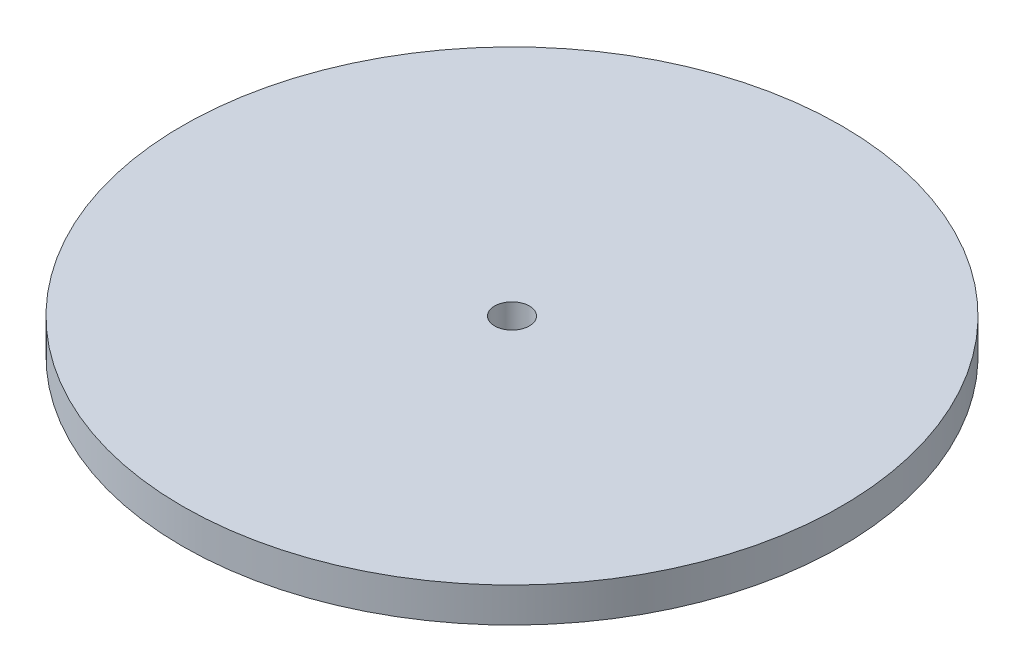
ISO-10303-21;
HEADER;
FILE_DESCRIPTION(('STEP AP214'),'2;1');
FILE_NAME('part.step','',(''),(''),'','','');
FILE_SCHEMA(('AUTOMOTIVE_DESIGN { 1 0 10303 214 1 1 1 1 }'));
ENDSEC;
DATA;
#1=APPLICATION_CONTEXT('core data for automotive mechanical design processes');
#2=APPLICATION_PROTOCOL_DEFINITION('international standard','automotive_design',2000,#1);
#3=PRODUCT_CONTEXT('',#1,'mechanical');
#4=PRODUCT('Part','Part','',(#3));
#5=PRODUCT_RELATED_PRODUCT_CATEGORY('part','',(#4));
#6=PRODUCT_DEFINITION_FORMATION('','',#4);
#7=PRODUCT_DEFINITION_CONTEXT('part definition',#1,'design');
#8=PRODUCT_DEFINITION('design','',#6,#7);
#9=PRODUCT_DEFINITION_SHAPE('','',#8);
#10=(LENGTH_UNIT() NAMED_UNIT(*) SI_UNIT(.MILLI.,.METRE.));
#11=(NAMED_UNIT(*) PLANE_ANGLE_UNIT() SI_UNIT($,.RADIAN.));
#12=(NAMED_UNIT(*) SI_UNIT($,.STERADIAN.) SOLID_ANGLE_UNIT());
#13=UNCERTAINTY_MEASURE_WITH_UNIT(LENGTH_MEASURE(1.E-05),#10,'distance_accuracy_value','');
#14=(GEOMETRIC_REPRESENTATION_CONTEXT(3) GLOBAL_UNCERTAINTY_ASSIGNED_CONTEXT((#13)) GLOBAL_UNIT_ASSIGNED_CONTEXT((#10,
#11,#12)) REPRESENTATION_CONTEXT('',''));
#15=CARTESIAN_POINT('',(0.,0.,0.));
#16=DIRECTION('',(0.,0.,1.));
#17=DIRECTION('',(1.,0.,0.));
#18=AXIS2_PLACEMENT_3D('',#15,#16,#17);
#19=CARTESIAN_POINT('',(0.,2.,0.));
#20=DIRECTION('',(0.,-1.,0.));
#21=DIRECTION('',(0.,0.,-1.));
#22=AXIS2_PLACEMENT_3D('',#19,#20,#21);
#23=CYLINDRICAL_SURFACE('',#22,19.);
#24=CARTESIAN_POINT('',(0.,2.,0.));
#25=DIRECTION('',(0.,1.,0.));
#26=DIRECTION('',(0.,0.,1.));
#27=AXIS2_PLACEMENT_3D('',#24,#25,#26);
#28=CIRCLE('',#27,19.);
#29=CARTESIAN_POINT('',(0.,2.,19.));
#30=VERTEX_POINT('',#29);
#31=EDGE_CURVE('E10',#30,#30,#28,.T.);
#32=ORIENTED_EDGE('',*,*,#31,.F.);
#33=EDGE_LOOP('',(#32));
#34=FACE_BOUND('',#33,.T.);
#35=CARTESIAN_POINT('',(0.,0.,0.));
#36=DIRECTION('',(0.,1.,0.));
#37=DIRECTION('',(0.,0.,1.));
#38=AXIS2_PLACEMENT_3D('',#35,#36,#37);
#39=CIRCLE('',#38,19.);
#40=CARTESIAN_POINT('',(0.,0.,19.));
#41=VERTEX_POINT('',#40);
#42=EDGE_CURVE('E40',#41,#41,#39,.T.);
#43=ORIENTED_EDGE('',*,*,#42,.T.);
#44=EDGE_LOOP('',(#43));
#45=FACE_BOUND('',#44,.T.);
#46=ADVANCED_FACE('F37',(#34,#45),#23,.T.);
#47=CARTESIAN_POINT('',(0.,2.,0.));
#48=DIRECTION('',(0.,1.,0.));
#49=DIRECTION('',(0.,0.,1.));
#50=AXIS2_PLACEMENT_3D('',#47,#48,#49);
#51=PLANE('',#50);
#52=CARTESIAN_POINT('',(0.,2.,0.));
#53=DIRECTION('',(0.,1.,0.));
#54=DIRECTION('',(0.,0.,1.));
#55=AXIS2_PLACEMENT_3D('',#52,#53,#54);
#56=CIRCLE('',#55,1.);
#57=CARTESIAN_POINT('',(0.,2.,1.));
#58=VERTEX_POINT('',#57);
#59=EDGE_CURVE('E49',#58,#58,#56,.T.);
#60=ORIENTED_EDGE('',*,*,#59,.F.);
#61=EDGE_LOOP('',(#60));
#62=FACE_BOUND('',#61,.T.);
#63=ORIENTED_EDGE('',*,*,#31,.T.);
#64=EDGE_LOOP('',(#63));
#65=FACE_BOUND('',#64,.T.);
#66=ADVANCED_FACE('F64',(#62,#65),#51,.T.);
#67=CARTESIAN_POINT('',(0.,0.,0.));
#68=DIRECTION('',(0.,1.,0.));
#69=DIRECTION('',(0.,0.,1.));
#70=AXIS2_PLACEMENT_3D('',#67,#68,#69);
#71=PLANE('',#70);
#72=CARTESIAN_POINT('',(0.,0.,0.));
#73=DIRECTION('',(0.,1.,0.));
#74=DIRECTION('',(0.,0.,1.));
#75=AXIS2_PLACEMENT_3D('',#72,#73,#74);
#76=CIRCLE('',#75,1.);
#77=CARTESIAN_POINT('',(0.,0.,1.));
#78=VERTEX_POINT('',#77);
#79=EDGE_CURVE('E47',#78,#78,#76,.T.);
#80=ORIENTED_EDGE('',*,*,#79,.T.);
#81=EDGE_LOOP('',(#80));
#82=FACE_BOUND('',#81,.T.);
#83=ORIENTED_EDGE('',*,*,#42,.F.);
#84=EDGE_LOOP('',(#83));
#85=FACE_BOUND('',#84,.T.);
#86=ADVANCED_FACE('F55',(#82,#85),#71,.F.);
#87=CARTESIAN_POINT('',(0.,0.,0.));
#88=DIRECTION('',(0.,1.,0.));
#89=DIRECTION('',(0.,0.,1.));
#90=AXIS2_PLACEMENT_3D('',#87,#88,#89);
#91=CYLINDRICAL_SURFACE('',#90,1.);
#92=ORIENTED_EDGE('',*,*,#79,.F.);
#93=EDGE_LOOP('',(#92));
#94=FACE_BOUND('',#93,.T.);
#95=ORIENTED_EDGE('',*,*,#59,.T.);
#96=EDGE_LOOP('',(#95));
#97=FACE_BOUND('',#96,.T.);
#98=ADVANCED_FACE('F58',(#94,#97),#91,.F.);
#99=CLOSED_SHELL('',(#46,#66,#86,#98));
#100=MANIFOLD_SOLID_BREP('B2',#99);
#101=ADVANCED_BREP_SHAPE_REPRESENTATION('',(#18,#100),#14);
#102=SHAPE_DEFINITION_REPRESENTATION(#9,#101);
ENDSEC;
END-ISO-10303-21;
